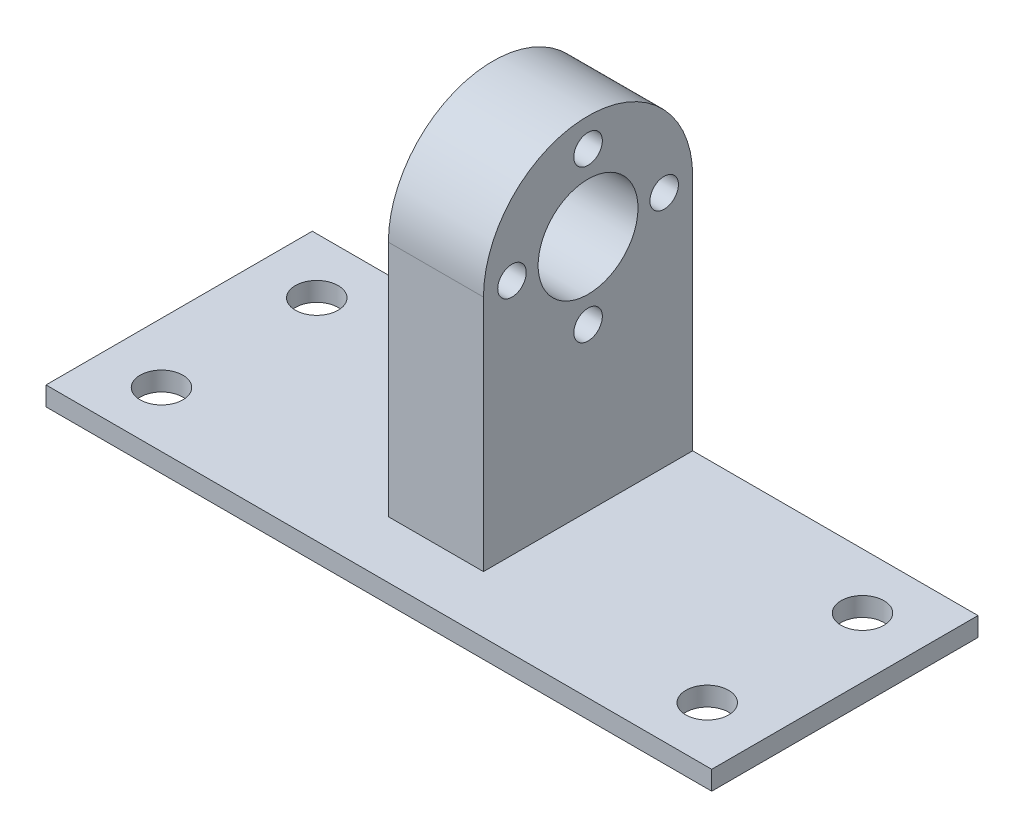
ISO-10303-21;
HEADER;
FILE_DESCRIPTION(('STEP AP214'),'2;1');
FILE_NAME('part.step','',(''),(''),'','','');
FILE_SCHEMA(('AUTOMOTIVE_DESIGN { 1 0 10303 214 1 1 1 1 }'));
ENDSEC;
DATA;
#1=APPLICATION_CONTEXT('core data for automotive mechanical design processes');
#2=APPLICATION_PROTOCOL_DEFINITION('international standard','automotive_design',2000,#1);
#3=PRODUCT_CONTEXT('',#1,'mechanical');
#4=PRODUCT('Part','Part','',(#3));
#5=PRODUCT_RELATED_PRODUCT_CATEGORY('part','',(#4));
#6=PRODUCT_DEFINITION_FORMATION('','',#4);
#7=PRODUCT_DEFINITION_CONTEXT('part definition',#1,'design');
#8=PRODUCT_DEFINITION('design','',#6,#7);
#9=PRODUCT_DEFINITION_SHAPE('','',#8);
#10=(LENGTH_UNIT() NAMED_UNIT(*) SI_UNIT(.MILLI.,.METRE.));
#11=(NAMED_UNIT(*) PLANE_ANGLE_UNIT() SI_UNIT($,.RADIAN.));
#12=(NAMED_UNIT(*) SI_UNIT($,.STERADIAN.) SOLID_ANGLE_UNIT());
#13=UNCERTAINTY_MEASURE_WITH_UNIT(LENGTH_MEASURE(1.E-05),#10,'distance_accuracy_value','');
#14=(GEOMETRIC_REPRESENTATION_CONTEXT(3) GLOBAL_UNCERTAINTY_ASSIGNED_CONTEXT((#13)) GLOBAL_UNIT_ASSIGNED_CONTEXT((#10,
#11,#12)) REPRESENTATION_CONTEXT('',''));
#15=CARTESIAN_POINT('',(0.,0.,0.));
#16=DIRECTION('',(0.,0.,1.));
#17=DIRECTION('',(1.,0.,0.));
#18=AXIS2_PLACEMENT_3D('',#15,#16,#17);
#19=CARTESIAN_POINT('',(-35.,2.,14.));
#20=DIRECTION('',(1.,0.,0.));
#21=DIRECTION('',(0.,0.,-1.));
#22=AXIS2_PLACEMENT_3D('',#19,#20,#21);
#23=PLANE('',#22);
#24=DIRECTION('',(0.,0.,1.));
#25=VECTOR('',#24,1.);
#26=CARTESIAN_POINT('',(-35.,0.,14.));
#27=LINE('',#26,#25);
#28=CARTESIAN_POINT('',(-35.,0.,-14.));
#29=VERTEX_POINT('',#28);
#30=CARTESIAN_POINT('',(-35.,0.,14.));
#31=VERTEX_POINT('',#30);
#32=EDGE_CURVE('E143',#29,#31,#27,.T.);
#33=ORIENTED_EDGE('',*,*,#32,.T.);
#34=DIRECTION('',(0.,-1.,0.));
#35=VECTOR('',#34,1.);
#36=CARTESIAN_POINT('',(-35.,2.,14.));
#37=LINE('',#36,#35);
#38=CARTESIAN_POINT('',(-35.,2.,14.));
#39=VERTEX_POINT('',#38);
#40=EDGE_CURVE('E11',#39,#31,#37,.T.);
#41=ORIENTED_EDGE('',*,*,#40,.F.);
#42=DIRECTION('',(0.,0.,1.));
#43=VECTOR('',#42,1.);
#44=CARTESIAN_POINT('',(-35.,2.,14.));
#45=LINE('',#44,#43);
#46=CARTESIAN_POINT('',(-35.,2.,-14.));
#47=VERTEX_POINT('',#46);
#48=EDGE_CURVE('E131',#47,#39,#45,.T.);
#49=ORIENTED_EDGE('',*,*,#48,.F.);
#50=DIRECTION('',(0.,-1.,0.));
#51=VECTOR('',#50,1.);
#52=CARTESIAN_POINT('',(-35.,2.,-14.));
#53=LINE('',#52,#51);
#54=EDGE_CURVE('E142',#47,#29,#53,.T.);
#55=ORIENTED_EDGE('',*,*,#54,.T.);
#56=EDGE_LOOP('',(#33,#41,#49,#55));
#57=FACE_BOUND('',#56,.T.);
#58=ADVANCED_FACE('F35',(#57),#23,.F.);
#59=CARTESIAN_POINT('',(35.,2.,14.));
#60=DIRECTION('',(0.,0.,-1.));
#61=DIRECTION('',(-1.,0.,0.));
#62=AXIS2_PLACEMENT_3D('',#59,#60,#61);
#63=PLANE('',#62);
#64=DIRECTION('',(1.,0.,0.));
#65=VECTOR('',#64,1.);
#66=CARTESIAN_POINT('',(35.,0.,14.));
#67=LINE('',#66,#65);
#68=CARTESIAN_POINT('',(35.,0.,14.));
#69=VERTEX_POINT('',#68);
#70=EDGE_CURVE('E146',#31,#69,#67,.T.);
#71=ORIENTED_EDGE('',*,*,#70,.T.);
#72=DIRECTION('',(0.,-1.,0.));
#73=VECTOR('',#72,1.);
#74=CARTESIAN_POINT('',(35.,2.,14.));
#75=LINE('',#74,#73);
#76=CARTESIAN_POINT('',(35.,2.,14.));
#77=VERTEX_POINT('',#76);
#78=EDGE_CURVE('E42',#77,#69,#75,.T.);
#79=ORIENTED_EDGE('',*,*,#78,.F.);
#80=DIRECTION('',(1.,0.,0.));
#81=VECTOR('',#80,1.);
#82=CARTESIAN_POINT('',(35.,2.,14.));
#83=LINE('',#82,#81);
#84=EDGE_CURVE('E134',#39,#77,#83,.T.);
#85=ORIENTED_EDGE('',*,*,#84,.F.);
#86=ORIENTED_EDGE('',*,*,#40,.T.);
#87=EDGE_LOOP('',(#71,#79,#85,#86));
#88=FACE_BOUND('',#87,.T.);
#89=ADVANCED_FACE('F200',(#88),#63,.F.);
#90=CARTESIAN_POINT('',(35.,2.,14.));
#91=DIRECTION('',(-1.,0.,0.));
#92=DIRECTION('',(0.,0.,1.));
#93=AXIS2_PLACEMENT_3D('',#90,#91,#92);
#94=PLANE('',#93);
#95=DIRECTION('',(0.,0.,-1.));
#96=VECTOR('',#95,1.);
#97=CARTESIAN_POINT('',(35.,0.,14.));
#98=LINE('',#97,#96);
#99=CARTESIAN_POINT('',(35.,0.,-14.));
#100=VERTEX_POINT('',#99);
#101=EDGE_CURVE('E148',#69,#100,#98,.T.);
#102=ORIENTED_EDGE('',*,*,#101,.T.);
#103=DIRECTION('',(0.,-1.,0.));
#104=VECTOR('',#103,1.);
#105=CARTESIAN_POINT('',(35.,2.,-14.));
#106=LINE('',#105,#104);
#107=CARTESIAN_POINT('',(35.,2.,-14.));
#108=VERTEX_POINT('',#107);
#109=EDGE_CURVE('E153',#108,#100,#106,.T.);
#110=ORIENTED_EDGE('',*,*,#109,.F.);
#111=DIRECTION('',(0.,0.,-1.));
#112=VECTOR('',#111,1.);
#113=CARTESIAN_POINT('',(35.,2.,14.));
#114=LINE('',#113,#112);
#115=EDGE_CURVE('E137',#77,#108,#114,.T.);
#116=ORIENTED_EDGE('',*,*,#115,.F.);
#117=ORIENTED_EDGE('',*,*,#78,.T.);
#118=EDGE_LOOP('',(#102,#110,#116,#117));
#119=FACE_BOUND('',#118,.T.);
#120=ADVANCED_FACE('F160',(#119),#94,.F.);
#121=CARTESIAN_POINT('',(35.,2.,-14.));
#122=DIRECTION('',(0.,0.,1.));
#123=DIRECTION('',(1.,0.,0.));
#124=AXIS2_PLACEMENT_3D('',#121,#122,#123);
#125=PLANE('',#124);
#126=DIRECTION('',(-1.,0.,0.));
#127=VECTOR('',#126,1.);
#128=CARTESIAN_POINT('',(35.,0.,-14.));
#129=LINE('',#128,#127);
#130=EDGE_CURVE('E135',#100,#29,#129,.T.);
#131=ORIENTED_EDGE('',*,*,#130,.T.);
#132=ORIENTED_EDGE('',*,*,#54,.F.);
#133=DIRECTION('',(-1.,0.,0.));
#134=VECTOR('',#133,1.);
#135=CARTESIAN_POINT('',(35.,2.,-14.));
#136=LINE('',#135,#134);
#137=CARTESIAN_POINT('',(-5.,2.,-14.));
#138=VERTEX_POINT('',#137);
#139=EDGE_CURVE('E139',#138,#47,#136,.T.);
#140=ORIENTED_EDGE('',*,*,#139,.F.);
#141=DIRECTION('',(0.,-1.,0.));
#142=VECTOR('',#141,1.);
#143=CARTESIAN_POINT('',(-5.,500000.,-14.));
#144=LINE('',#143,#142);
#145=CARTESIAN_POINT('',(-5.,27.0000000001005,-14.));
#146=VERTEX_POINT('',#145);
#147=EDGE_CURVE('E118',#146,#138,#144,.T.);
#148=ORIENTED_EDGE('',*,*,#147,.F.);
#149=DIRECTION('',(-1.,0.,0.));
#150=VECTOR('',#149,1.);
#151=CARTESIAN_POINT('',(5.,27.,-14.));
#152=LINE('',#151,#150);
#153=CARTESIAN_POINT('',(5.,27.0000000001005,-14.));
#154=VERTEX_POINT('',#153);
#155=EDGE_CURVE('E101',#146,#154,#152,.F.);
#156=ORIENTED_EDGE('',*,*,#155,.T.);
#157=DIRECTION('',(0.,-1.,0.));
#158=VECTOR('',#157,1.);
#159=CARTESIAN_POINT('',(5.,500000.,-14.));
#160=LINE('',#159,#158);
#161=CARTESIAN_POINT('',(5.,2.,-14.));
#162=VERTEX_POINT('',#161);
#163=EDGE_CURVE('E115',#154,#162,#160,.T.);
#164=ORIENTED_EDGE('',*,*,#163,.T.);
#165=EDGE_CURVE('E140',#108,#162,#136,.T.);
#166=ORIENTED_EDGE('',*,*,#165,.F.);
#167=ORIENTED_EDGE('',*,*,#109,.T.);
#168=EDGE_LOOP('',(#131,#132,#140,#148,#156,#164,#166,#167));
#169=FACE_BOUND('',#168,.T.);
#170=ADVANCED_FACE('F113',(#169),#125,.F.);
#171=CARTESIAN_POINT('',(0.,2.,0.));
#172=DIRECTION('',(0.,1.,0.));
#173=DIRECTION('',(0.,0.,1.));
#174=AXIS2_PLACEMENT_3D('',#171,#172,#173);
#175=PLANE('',#174);
#176=CARTESIAN_POINT('',(28.6924006873344,2.,-8.16223371545604));
#177=DIRECTION('',(0.,-1.,0.));
#178=DIRECTION('',(0.,0.,1.));
#179=AXIS2_PLACEMENT_3D('',#176,#177,#178);
#180=CIRCLE('',#179,2.25);
#181=CARTESIAN_POINT('',(28.6924006873344,2.,-5.91223371545604));
#182=VERTEX_POINT('',#181);
#183=EDGE_CURVE('E239',#182,#182,#180,.T.);
#184=ORIENTED_EDGE('',*,*,#183,.T.);
#185=EDGE_LOOP('',(#184));
#186=FACE_BOUND('',#185,.T.);
#187=CARTESIAN_POINT('',(28.6924006873344,2.,8.16223371545605));
#188=DIRECTION('',(0.,1.,0.));
#189=DIRECTION('',(0.,0.,-1.));
#190=AXIS2_PLACEMENT_3D('',#187,#188,#189);
#191=CIRCLE('',#190,2.25);
#192=CARTESIAN_POINT('',(28.6924006873344,2.,5.91223371545605));
#193=VERTEX_POINT('',#192);
#194=EDGE_CURVE('E249',#193,#193,#191,.T.);
#195=ORIENTED_EDGE('',*,*,#194,.F.);
#196=EDGE_LOOP('',(#195));
#197=FACE_BOUND('',#196,.T.);
#198=CARTESIAN_POINT('',(-28.6924006873344,2.,8.16223371545605));
#199=DIRECTION('',(0.,-1.,0.));
#200=DIRECTION('',(0.,0.,-1.));
#201=AXIS2_PLACEMENT_3D('',#198,#199,#200);
#202=CIRCLE('',#201,2.25);
#203=CARTESIAN_POINT('',(-28.6924006873344,2.,5.91223371545605));
#204=VERTEX_POINT('',#203);
#205=EDGE_CURVE('E255',#204,#204,#202,.T.);
#206=ORIENTED_EDGE('',*,*,#205,.T.);
#207=EDGE_LOOP('',(#206));
#208=FACE_BOUND('',#207,.T.);
#209=CARTESIAN_POINT('',(-28.6924006873344,2.,-8.16223371545604));
#210=DIRECTION('',(0.,1.,0.));
#211=DIRECTION('',(0.,0.,1.));
#212=AXIS2_PLACEMENT_3D('',#209,#210,#211);
#213=CIRCLE('',#212,2.25);
#214=CARTESIAN_POINT('',(-28.6924006873344,2.,-5.91223371545604));
#215=VERTEX_POINT('',#214);
#216=EDGE_CURVE('E261',#215,#215,#213,.T.);
#217=ORIENTED_EDGE('',*,*,#216,.F.);
#218=EDGE_LOOP('',(#217));
#219=FACE_BOUND('',#218,.T.);
#220=DIRECTION('',(0.,0.,1.));
#221=VECTOR('',#220,1.);
#222=CARTESIAN_POINT('',(-5.,2.,8.));
#223=LINE('',#222,#221);
#224=CARTESIAN_POINT('',(-5.,2.,8.));
#225=VERTEX_POINT('',#224);
#226=EDGE_CURVE('E54',#138,#225,#223,.T.);
#227=ORIENTED_EDGE('',*,*,#226,.F.);
#228=ORIENTED_EDGE('',*,*,#139,.T.);
#229=ORIENTED_EDGE('',*,*,#48,.T.);
#230=ORIENTED_EDGE('',*,*,#84,.T.);
#231=ORIENTED_EDGE('',*,*,#115,.T.);
#232=ORIENTED_EDGE('',*,*,#165,.T.);
#233=DIRECTION('',(0.,0.,-1.));
#234=VECTOR('',#233,1.);
#235=CARTESIAN_POINT('',(5.,2.,7.99999999999999));
#236=LINE('',#235,#234);
#237=CARTESIAN_POINT('',(5.,2.,7.99999999999999));
#238=VERTEX_POINT('',#237);
#239=EDGE_CURVE('E123',#238,#162,#236,.T.);
#240=ORIENTED_EDGE('',*,*,#239,.F.);
#241=DIRECTION('',(1.,0.,0.));
#242=VECTOR('',#241,1.);
#243=CARTESIAN_POINT('',(5.,2.,7.99999999999999));
#244=LINE('',#243,#242);
#245=EDGE_CURVE('E49',#225,#238,#244,.T.);
#246=ORIENTED_EDGE('',*,*,#245,.F.);
#247=EDGE_LOOP('',(#227,#228,#229,#230,#231,#232,#240,#246));
#248=FACE_BOUND('',#247,.T.);
#249=ADVANCED_FACE('F171',(#186,#197,#208,#219,#248),#175,.T.);
#250=CARTESIAN_POINT('',(0.,0.,0.));
#251=DIRECTION('',(0.,1.,0.));
#252=DIRECTION('',(0.,0.,1.));
#253=AXIS2_PLACEMENT_3D('',#250,#251,#252);
#254=PLANE('',#253);
#255=CARTESIAN_POINT('',(28.6924006873344,0.,-8.16223371545604));
#256=DIRECTION('',(0.,-1.,0.));
#257=DIRECTION('',(0.,0.,1.));
#258=AXIS2_PLACEMENT_3D('',#255,#256,#257);
#259=CIRCLE('',#258,2.25);
#260=CARTESIAN_POINT('',(28.6924006873344,0.,-5.91223371545604));
#261=VERTEX_POINT('',#260);
#262=EDGE_CURVE('E246',#261,#261,#259,.T.);
#263=ORIENTED_EDGE('',*,*,#262,.F.);
#264=EDGE_LOOP('',(#263));
#265=FACE_BOUND('',#264,.T.);
#266=CARTESIAN_POINT('',(28.6924006873344,0.,8.16223371545605));
#267=DIRECTION('',(0.,1.,0.));
#268=DIRECTION('',(0.,0.,-1.));
#269=AXIS2_PLACEMENT_3D('',#266,#267,#268);
#270=CIRCLE('',#269,2.25);
#271=CARTESIAN_POINT('',(28.6924006873344,0.,5.91223371545605));
#272=VERTEX_POINT('',#271);
#273=EDGE_CURVE('E252',#272,#272,#270,.T.);
#274=ORIENTED_EDGE('',*,*,#273,.T.);
#275=EDGE_LOOP('',(#274));
#276=FACE_BOUND('',#275,.T.);
#277=CARTESIAN_POINT('',(-28.6924006873344,0.,8.16223371545605));
#278=DIRECTION('',(0.,-1.,0.));
#279=DIRECTION('',(0.,0.,-1.));
#280=AXIS2_PLACEMENT_3D('',#277,#278,#279);
#281=CIRCLE('',#280,2.25);
#282=CARTESIAN_POINT('',(-28.6924006873344,0.,5.91223371545605));
#283=VERTEX_POINT('',#282);
#284=EDGE_CURVE('E258',#283,#283,#281,.T.);
#285=ORIENTED_EDGE('',*,*,#284,.F.);
#286=EDGE_LOOP('',(#285));
#287=FACE_BOUND('',#286,.T.);
#288=CARTESIAN_POINT('',(-28.6924006873344,0.,-8.16223371545604));
#289=DIRECTION('',(0.,1.,0.));
#290=DIRECTION('',(0.,0.,1.));
#291=AXIS2_PLACEMENT_3D('',#288,#289,#290);
#292=CIRCLE('',#291,2.25);
#293=CARTESIAN_POINT('',(-28.6924006873344,0.,-5.91223371545604));
#294=VERTEX_POINT('',#293);
#295=EDGE_CURVE('E264',#294,#294,#292,.T.);
#296=ORIENTED_EDGE('',*,*,#295,.T.);
#297=EDGE_LOOP('',(#296));
#298=FACE_BOUND('',#297,.T.);
#299=ORIENTED_EDGE('',*,*,#32,.F.);
#300=ORIENTED_EDGE('',*,*,#130,.F.);
#301=ORIENTED_EDGE('',*,*,#101,.F.);
#302=ORIENTED_EDGE('',*,*,#70,.F.);
#303=EDGE_LOOP('',(#299,#300,#301,#302));
#304=FACE_BOUND('',#303,.T.);
#305=ADVANCED_FACE('F166',(#265,#276,#287,#298,#304),#254,.F.);
#306=CARTESIAN_POINT('',(5.,500000.,7.99999999999999));
#307=DIRECTION('',(0.,0.,-1.));
#308=DIRECTION('',(-1.,0.,0.));
#309=AXIS2_PLACEMENT_3D('',#306,#307,#308);
#310=PLANE('',#309);
#311=DIRECTION('',(-1.,0.,0.));
#312=VECTOR('',#311,1.);
#313=CARTESIAN_POINT('',(5.,27.,7.99999999999999));
#314=LINE('',#313,#312);
#315=CARTESIAN_POINT('',(-5.,27.,7.99999999999999));
#316=VERTEX_POINT('',#315);
#317=CARTESIAN_POINT('',(5.,27.,7.99999999999999));
#318=VERTEX_POINT('',#317);
#319=EDGE_CURVE('E104',#316,#318,#314,.F.);
#320=ORIENTED_EDGE('',*,*,#319,.F.);
#321=DIRECTION('',(0.,-1.,0.));
#322=VECTOR('',#321,1.);
#323=CARTESIAN_POINT('',(-5.,500000.,8.));
#324=LINE('',#323,#322);
#325=EDGE_CURVE('E119',#316,#225,#324,.T.);
#326=ORIENTED_EDGE('',*,*,#325,.T.);
#327=ORIENTED_EDGE('',*,*,#245,.T.);
#328=DIRECTION('',(0.,-1.,0.));
#329=VECTOR('',#328,1.);
#330=CARTESIAN_POINT('',(5.,500000.,7.99999999999999));
#331=LINE('',#330,#329);
#332=EDGE_CURVE('E124',#318,#238,#331,.T.);
#333=ORIENTED_EDGE('',*,*,#332,.F.);
#334=EDGE_LOOP('',(#320,#326,#327,#333));
#335=FACE_BOUND('',#334,.T.);
#336=ADVANCED_FACE('F186',(#335),#310,.F.);
#337=CARTESIAN_POINT('',(5.,500000.,7.99999999999999));
#338=DIRECTION('',(-1.,0.,0.));
#339=DIRECTION('',(0.,0.,1.));
#340=AXIS2_PLACEMENT_3D('',#337,#338,#339);
#341=PLANE('',#340);
#342=CARTESIAN_POINT('',(5.,27.,-11.));
#343=DIRECTION('',(-1.,0.,0.));
#344=DIRECTION('',(0.,0.,1.));
#345=AXIS2_PLACEMENT_3D('',#342,#343,#344);
#346=CIRCLE('',#345,1.5);
#347=CARTESIAN_POINT('',(5.,27.,-9.5));
#348=VERTEX_POINT('',#347);
#349=EDGE_CURVE('E236',#348,#348,#346,.T.);
#350=ORIENTED_EDGE('',*,*,#349,.T.);
#351=EDGE_LOOP('',(#350));
#352=FACE_BOUND('',#351,.T.);
#353=CARTESIAN_POINT('',(5.,27.,5.));
#354=DIRECTION('',(-1.,0.,0.));
#355=DIRECTION('',(0.,0.,1.));
#356=AXIS2_PLACEMENT_3D('',#353,#354,#355);
#357=CIRCLE('',#356,1.5);
#358=CARTESIAN_POINT('',(5.,27.,6.5));
#359=VERTEX_POINT('',#358);
#360=EDGE_CURVE('E242',#359,#359,#357,.T.);
#361=ORIENTED_EDGE('',*,*,#360,.T.);
#362=EDGE_LOOP('',(#361));
#363=FACE_BOUND('',#362,.T.);
#364=CARTESIAN_POINT('',(5.,19.,-3.));
#365=DIRECTION('',(-1.,0.,0.));
#366=DIRECTION('',(0.,0.,1.));
#367=AXIS2_PLACEMENT_3D('',#364,#365,#366);
#368=CIRCLE('',#367,1.5);
#369=CARTESIAN_POINT('',(5.,19.,-1.5));
#370=VERTEX_POINT('',#369);
#371=EDGE_CURVE('E318',#370,#370,#368,.T.);
#372=ORIENTED_EDGE('',*,*,#371,.T.);
#373=EDGE_LOOP('',(#372));
#374=FACE_BOUND('',#373,.T.);
#375=CARTESIAN_POINT('',(5.,35.,-3.00000000000001));
#376=DIRECTION('',(-1.,0.,0.));
#377=DIRECTION('',(0.,0.,1.));
#378=AXIS2_PLACEMENT_3D('',#375,#376,#377);
#379=CIRCLE('',#378,1.5);
#380=CARTESIAN_POINT('',(5.,35.,-1.5));
#381=VERTEX_POINT('',#380);
#382=EDGE_CURVE('E235',#381,#381,#379,.T.);
#383=ORIENTED_EDGE('',*,*,#382,.T.);
#384=EDGE_LOOP('',(#383));
#385=FACE_BOUND('',#384,.T.);
#386=ORIENTED_EDGE('',*,*,#163,.F.);
#387=CARTESIAN_POINT('',(5.,27.,-3.));
#388=DIRECTION('',(1.,0.,0.));
#389=DIRECTION('',(0.,0.,-1.));
#390=AXIS2_PLACEMENT_3D('',#387,#388,#389);
#391=CIRCLE('',#390,11.);
#392=EDGE_CURVE('E98',#154,#318,#391,.T.);
#393=ORIENTED_EDGE('',*,*,#392,.T.);
#394=ORIENTED_EDGE('',*,*,#332,.T.);
#395=ORIENTED_EDGE('',*,*,#239,.T.);
#396=EDGE_LOOP('',(#386,#393,#394,#395));
#397=FACE_BOUND('',#396,.T.);
#398=CARTESIAN_POINT('',(5.,27.,-3.));
#399=DIRECTION('',(1.,0.,0.));
#400=DIRECTION('',(0.,0.,-1.));
#401=AXIS2_PLACEMENT_3D('',#398,#399,#400);
#402=CIRCLE('',#401,5.25);
#403=CARTESIAN_POINT('',(5.,27.,-8.25));
#404=VERTEX_POINT('',#403);
#405=EDGE_CURVE('E176',#404,#404,#402,.T.);
#406=ORIENTED_EDGE('',*,*,#405,.F.);
#407=EDGE_LOOP('',(#406));
#408=FACE_BOUND('',#407,.T.);
#409=ADVANCED_FACE('F121',(#352,#363,#374,#385,#397,#408),#341,.F.);
#410=CARTESIAN_POINT('',(-5.,500000.,8.));
#411=DIRECTION('',(1.,0.,0.));
#412=DIRECTION('',(0.,0.,-1.));
#413=AXIS2_PLACEMENT_3D('',#410,#411,#412);
#414=PLANE('',#413);
#415=CARTESIAN_POINT('',(-5.,27.,-11.));
#416=DIRECTION('',(-1.,0.,0.));
#417=DIRECTION('',(0.,0.,1.));
#418=AXIS2_PLACEMENT_3D('',#415,#416,#417);
#419=CIRCLE('',#418,1.5);
#420=CARTESIAN_POINT('',(-5.,27.,-9.5));
#421=VERTEX_POINT('',#420);
#422=EDGE_CURVE('E222',#421,#421,#419,.T.);
#423=ORIENTED_EDGE('',*,*,#422,.F.);
#424=EDGE_LOOP('',(#423));
#425=FACE_BOUND('',#424,.T.);
#426=CARTESIAN_POINT('',(-5.,27.,5.));
#427=DIRECTION('',(-1.,0.,0.));
#428=DIRECTION('',(0.,0.,1.));
#429=AXIS2_PLACEMENT_3D('',#426,#427,#428);
#430=CIRCLE('',#429,1.5);
#431=CARTESIAN_POINT('',(-5.,27.,6.5));
#432=VERTEX_POINT('',#431);
#433=EDGE_CURVE('E226',#432,#432,#430,.T.);
#434=ORIENTED_EDGE('',*,*,#433,.F.);
#435=EDGE_LOOP('',(#434));
#436=FACE_BOUND('',#435,.T.);
#437=CARTESIAN_POINT('',(-5.,19.,-3.));
#438=DIRECTION('',(-1.,0.,0.));
#439=DIRECTION('',(0.,0.,1.));
#440=AXIS2_PLACEMENT_3D('',#437,#438,#439);
#441=CIRCLE('',#440,1.5);
#442=CARTESIAN_POINT('',(-5.,19.,-1.5));
#443=VERTEX_POINT('',#442);
#444=EDGE_CURVE('E230',#443,#443,#441,.T.);
#445=ORIENTED_EDGE('',*,*,#444,.F.);
#446=EDGE_LOOP('',(#445));
#447=FACE_BOUND('',#446,.T.);
#448=CARTESIAN_POINT('',(-5.,35.,-3.00000000000001));
#449=DIRECTION('',(-1.,0.,0.));
#450=DIRECTION('',(0.,0.,1.));
#451=AXIS2_PLACEMENT_3D('',#448,#449,#450);
#452=CIRCLE('',#451,1.5);
#453=CARTESIAN_POINT('',(-5.,35.,-1.5));
#454=VERTEX_POINT('',#453);
#455=EDGE_CURVE('E233',#454,#454,#452,.T.);
#456=ORIENTED_EDGE('',*,*,#455,.F.);
#457=EDGE_LOOP('',(#456));
#458=FACE_BOUND('',#457,.T.);
#459=ORIENTED_EDGE('',*,*,#325,.F.);
#460=CARTESIAN_POINT('',(-5.,27.,-3.));
#461=DIRECTION('',(1.,0.,0.));
#462=DIRECTION('',(0.,0.,-1.));
#463=AXIS2_PLACEMENT_3D('',#460,#461,#462);
#464=CIRCLE('',#463,11.);
#465=EDGE_CURVE('E109',#146,#316,#464,.T.);
#466=ORIENTED_EDGE('',*,*,#465,.F.);
#467=ORIENTED_EDGE('',*,*,#147,.T.);
#468=ORIENTED_EDGE('',*,*,#226,.T.);
#469=EDGE_LOOP('',(#459,#466,#467,#468));
#470=FACE_BOUND('',#469,.T.);
#471=CARTESIAN_POINT('',(-5.,27.,-3.));
#472=DIRECTION('',(1.,0.,0.));
#473=DIRECTION('',(0.,0.,-1.));
#474=AXIS2_PLACEMENT_3D('',#471,#472,#473);
#475=CIRCLE('',#474,5.25);
#476=CARTESIAN_POINT('',(-5.,27.,-8.25));
#477=VERTEX_POINT('',#476);
#478=EDGE_CURVE('E179',#477,#477,#475,.T.);
#479=ORIENTED_EDGE('',*,*,#478,.T.);
#480=EDGE_LOOP('',(#479));
#481=FACE_BOUND('',#480,.T.);
#482=ADVANCED_FACE('F174',(#425,#436,#447,#458,#470,#481),#414,.F.);
#483=CARTESIAN_POINT('',(5.,27.,-3.));
#484=DIRECTION('',(-1.,0.,0.));
#485=DIRECTION('',(0.,0.,1.));
#486=AXIS2_PLACEMENT_3D('',#483,#484,#485);
#487=CYLINDRICAL_SURFACE('',#486,11.);
#488=ORIENTED_EDGE('',*,*,#155,.F.);
#489=ORIENTED_EDGE('',*,*,#465,.T.);
#490=ORIENTED_EDGE('',*,*,#319,.T.);
#491=ORIENTED_EDGE('',*,*,#392,.F.);
#492=EDGE_LOOP('',(#488,#489,#490,#491));
#493=FACE_BOUND('',#492,.T.);
#494=ADVANCED_FACE('F100',(#493),#487,.T.);
#495=CARTESIAN_POINT('',(5.,27.,-3.));
#496=DIRECTION('',(-1.,0.,0.));
#497=DIRECTION('',(0.,0.,1.));
#498=AXIS2_PLACEMENT_3D('',#495,#496,#497);
#499=CYLINDRICAL_SURFACE('',#498,5.25);
#500=ORIENTED_EDGE('',*,*,#405,.T.);
#501=EDGE_LOOP('',(#500));
#502=FACE_BOUND('',#501,.T.);
#503=ORIENTED_EDGE('',*,*,#478,.F.);
#504=EDGE_LOOP('',(#503));
#505=FACE_BOUND('',#504,.T.);
#506=ADVANCED_FACE('F218',(#502,#505),#499,.F.);
#507=CARTESIAN_POINT('',(-28.6924006873344,0.,-8.16223371545604));
#508=DIRECTION('',(0.,1.,0.));
#509=DIRECTION('',(0.,0.,1.));
#510=AXIS2_PLACEMENT_3D('',#507,#508,#509);
#511=CYLINDRICAL_SURFACE('',#510,2.25);
#512=ORIENTED_EDGE('',*,*,#295,.F.);
#513=EDGE_LOOP('',(#512));
#514=FACE_BOUND('',#513,.T.);
#515=ORIENTED_EDGE('',*,*,#216,.T.);
#516=EDGE_LOOP('',(#515));
#517=FACE_BOUND('',#516,.T.);
#518=ADVANCED_FACE('F272',(#514,#517),#511,.F.);
#519=CARTESIAN_POINT('',(-28.6924006873344,0.,8.16223371545605));
#520=DIRECTION('',(0.,1.,0.));
#521=DIRECTION('',(0.,0.,1.));
#522=AXIS2_PLACEMENT_3D('',#519,#520,#521);
#523=CYLINDRICAL_SURFACE('',#522,2.25);
#524=ORIENTED_EDGE('',*,*,#284,.T.);
#525=EDGE_LOOP('',(#524));
#526=FACE_BOUND('',#525,.T.);
#527=ORIENTED_EDGE('',*,*,#205,.F.);
#528=EDGE_LOOP('',(#527));
#529=FACE_BOUND('',#528,.T.);
#530=ADVANCED_FACE('F278',(#526,#529),#523,.F.);
#531=CARTESIAN_POINT('',(28.6924006873344,0.,8.16223371545605));
#532=DIRECTION('',(0.,1.,0.));
#533=DIRECTION('',(0.,0.,1.));
#534=AXIS2_PLACEMENT_3D('',#531,#532,#533);
#535=CYLINDRICAL_SURFACE('',#534,2.25);
#536=ORIENTED_EDGE('',*,*,#273,.F.);
#537=EDGE_LOOP('',(#536));
#538=FACE_BOUND('',#537,.T.);
#539=ORIENTED_EDGE('',*,*,#194,.T.);
#540=EDGE_LOOP('',(#539));
#541=FACE_BOUND('',#540,.T.);
#542=ADVANCED_FACE('F284',(#538,#541),#535,.F.);
#543=CARTESIAN_POINT('',(28.6924006873344,0.,-8.16223371545604));
#544=DIRECTION('',(0.,1.,0.));
#545=DIRECTION('',(0.,0.,1.));
#546=AXIS2_PLACEMENT_3D('',#543,#544,#545);
#547=CYLINDRICAL_SURFACE('',#546,2.25);
#548=ORIENTED_EDGE('',*,*,#262,.T.);
#549=EDGE_LOOP('',(#548));
#550=FACE_BOUND('',#549,.T.);
#551=ORIENTED_EDGE('',*,*,#183,.F.);
#552=EDGE_LOOP('',(#551));
#553=FACE_BOUND('',#552,.T.);
#554=ADVANCED_FACE('F288',(#550,#553),#547,.F.);
#555=CARTESIAN_POINT('',(35.,35.,-3.00000000000001));
#556=DIRECTION('',(-1.,0.,0.));
#557=DIRECTION('',(0.,0.,1.));
#558=AXIS2_PLACEMENT_3D('',#555,#556,#557);
#559=CYLINDRICAL_SURFACE('',#558,1.5);
#560=ORIENTED_EDGE('',*,*,#455,.T.);
#561=EDGE_LOOP('',(#560));
#562=FACE_BOUND('',#561,.T.);
#563=ORIENTED_EDGE('',*,*,#382,.F.);
#564=EDGE_LOOP('',(#563));
#565=FACE_BOUND('',#564,.T.);
#566=ADVANCED_FACE('F292',(#562,#565),#559,.F.);
#567=CARTESIAN_POINT('',(35.,19.,-3.));
#568=DIRECTION('',(-1.,0.,0.));
#569=DIRECTION('',(0.,0.,1.));
#570=AXIS2_PLACEMENT_3D('',#567,#568,#569);
#571=CYLINDRICAL_SURFACE('',#570,1.5);
#572=ORIENTED_EDGE('',*,*,#444,.T.);
#573=EDGE_LOOP('',(#572));
#574=FACE_BOUND('',#573,.T.);
#575=ORIENTED_EDGE('',*,*,#371,.F.);
#576=EDGE_LOOP('',(#575));
#577=FACE_BOUND('',#576,.T.);
#578=ADVANCED_FACE('F296',(#574,#577),#571,.F.);
#579=CARTESIAN_POINT('',(35.,27.,5.));
#580=DIRECTION('',(-1.,0.,0.));
#581=DIRECTION('',(0.,0.,1.));
#582=AXIS2_PLACEMENT_3D('',#579,#580,#581);
#583=CYLINDRICAL_SURFACE('',#582,1.5);
#584=ORIENTED_EDGE('',*,*,#433,.T.);
#585=EDGE_LOOP('',(#584));
#586=FACE_BOUND('',#585,.T.);
#587=ORIENTED_EDGE('',*,*,#360,.F.);
#588=EDGE_LOOP('',(#587));
#589=FACE_BOUND('',#588,.T.);
#590=ADVANCED_FACE('F299',(#586,#589),#583,.F.);
#591=CARTESIAN_POINT('',(35.,27.,-11.));
#592=DIRECTION('',(-1.,0.,0.));
#593=DIRECTION('',(0.,0.,1.));
#594=AXIS2_PLACEMENT_3D('',#591,#592,#593);
#595=CYLINDRICAL_SURFACE('',#594,1.5);
#596=ORIENTED_EDGE('',*,*,#422,.T.);
#597=EDGE_LOOP('',(#596));
#598=FACE_BOUND('',#597,.T.);
#599=ORIENTED_EDGE('',*,*,#349,.F.);
#600=EDGE_LOOP('',(#599));
#601=FACE_BOUND('',#600,.T.);
#602=ADVANCED_FACE('F303',(#598,#601),#595,.F.);
#603=CLOSED_SHELL('',(#58,#89,#120,#170,#249,#305,#336,#409,#482,#494,#506,#518,#530,#542,#554,
#566,#578,#590,#602));
#604=MANIFOLD_SOLID_BREP('B2',#603);
#605=ADVANCED_BREP_SHAPE_REPRESENTATION('',(#18,#604),#14);
#606=SHAPE_DEFINITION_REPRESENTATION(#9,#605);
ENDSEC;
END-ISO-10303-21;
